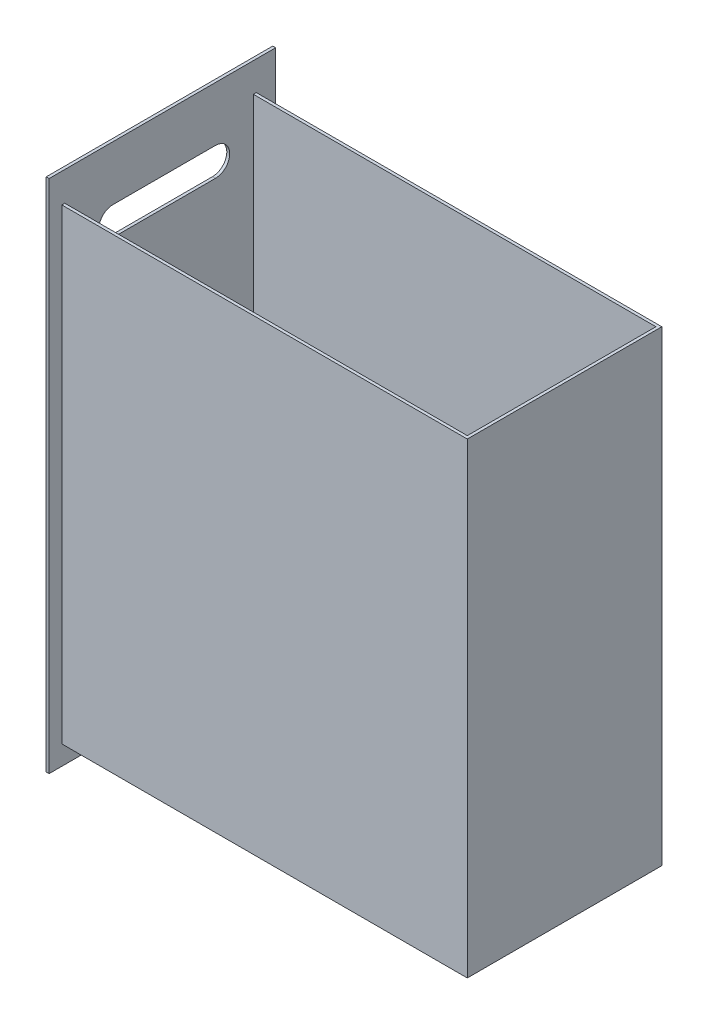
ISO-10303-21;
HEADER;
FILE_DESCRIPTION(('STEP AP214'),'2;1');
FILE_NAME('part.step','',(''),(''),'','','');
FILE_SCHEMA(('AUTOMOTIVE_DESIGN { 1 0 10303 214 1 1 1 1 }'));
ENDSEC;
DATA;
#1=APPLICATION_CONTEXT('core data for automotive mechanical design processes');
#2=APPLICATION_PROTOCOL_DEFINITION('international standard','automotive_design',2000,#1);
#3=PRODUCT_CONTEXT('',#1,'mechanical');
#4=PRODUCT('Part','Part','',(#3));
#5=PRODUCT_RELATED_PRODUCT_CATEGORY('part','',(#4));
#6=PRODUCT_DEFINITION_FORMATION('','',#4);
#7=PRODUCT_DEFINITION_CONTEXT('part definition',#1,'design');
#8=PRODUCT_DEFINITION('design','',#6,#7);
#9=PRODUCT_DEFINITION_SHAPE('','',#8);
#10=(LENGTH_UNIT() NAMED_UNIT(*) SI_UNIT(.MILLI.,.METRE.));
#11=(NAMED_UNIT(*) PLANE_ANGLE_UNIT() SI_UNIT($,.RADIAN.));
#12=(NAMED_UNIT(*) SI_UNIT($,.STERADIAN.) SOLID_ANGLE_UNIT());
#13=UNCERTAINTY_MEASURE_WITH_UNIT(LENGTH_MEASURE(1.E-05),#10,'distance_accuracy_value','');
#14=(GEOMETRIC_REPRESENTATION_CONTEXT(3) GLOBAL_UNCERTAINTY_ASSIGNED_CONTEXT((#13)) GLOBAL_UNIT_ASSIGNED_CONTEXT((#10,
#11,#12)) REPRESENTATION_CONTEXT('',''));
#15=CARTESIAN_POINT('',(0.,0.,0.));
#16=DIRECTION('',(0.,0.,1.));
#17=DIRECTION('',(1.,0.,0.));
#18=AXIS2_PLACEMENT_3D('',#15,#16,#17);
#19=CARTESIAN_POINT('',(-210.,3.,-100.));
#20=DIRECTION('',(0.,0.,1.));
#21=DIRECTION('',(1.,0.,0.));
#22=AXIS2_PLACEMENT_3D('',#19,#20,#21);
#23=PLANE('',#22);
#24=DIRECTION('',(0.,-1.,0.));
#25=VECTOR('',#24,1.);
#26=CARTESIAN_POINT('',(-207.,3.,-100.));
#27=LINE('',#26,#25);
#28=CARTESIAN_POINT('',(-207.,480.,-100.));
#29=VERTEX_POINT('',#28);
#30=CARTESIAN_POINT('',(-207.,0.,-100.));
#31=VERTEX_POINT('',#30);
#32=EDGE_CURVE('E251',#29,#31,#27,.T.);
#33=ORIENTED_EDGE('',*,*,#32,.F.);
#34=DIRECTION('',(-1.,0.,0.));
#35=VECTOR('',#34,1.);
#36=CARTESIAN_POINT('',(-210.,480.,-100.));
#37=LINE('',#36,#35);
#38=CARTESIAN_POINT('',(210.,480.,-100.));
#39=VERTEX_POINT('',#38);
#40=EDGE_CURVE('E284',#39,#29,#37,.T.);
#41=ORIENTED_EDGE('',*,*,#40,.F.);
#42=DIRECTION('',(0.,-1.,0.));
#43=VECTOR('',#42,1.);
#44=CARTESIAN_POINT('',(210.,3.,-100.));
#45=LINE('',#44,#43);
#46=CARTESIAN_POINT('',(210.,0.,-100.));
#47=VERTEX_POINT('',#46);
#48=EDGE_CURVE('E12',#39,#47,#45,.T.);
#49=ORIENTED_EDGE('',*,*,#48,.T.);
#50=DIRECTION('',(-1.,0.,0.));
#51=VECTOR('',#50,1.);
#52=CARTESIAN_POINT('',(-210.,0.,-100.));
#53=LINE('',#52,#51);
#54=EDGE_CURVE('E292',#47,#31,#53,.T.);
#55=ORIENTED_EDGE('',*,*,#54,.T.);
#56=EDGE_LOOP('',(#33,#41,#49,#55));
#57=FACE_BOUND('',#56,.T.);
#58=ADVANCED_FACE('F61',(#57),#23,.F.);
#59=CARTESIAN_POINT('',(-210.,3.,100.));
#60=DIRECTION('',(0.,0.,-1.));
#61=DIRECTION('',(-1.,0.,0.));
#62=AXIS2_PLACEMENT_3D('',#59,#60,#61);
#63=PLANE('',#62);
#64=DIRECTION('',(0.,1.,0.));
#65=VECTOR('',#64,1.);
#66=CARTESIAN_POINT('',(-207.,3.,100.));
#67=LINE('',#66,#65);
#68=CARTESIAN_POINT('',(-207.,0.,100.));
#69=VERTEX_POINT('',#68);
#70=CARTESIAN_POINT('',(-207.,480.,100.));
#71=VERTEX_POINT('',#70);
#72=EDGE_CURVE('E245',#69,#71,#67,.T.);
#73=ORIENTED_EDGE('',*,*,#72,.F.);
#74=DIRECTION('',(1.,0.,0.));
#75=VECTOR('',#74,1.);
#76=CARTESIAN_POINT('',(-210.,0.,100.));
#77=LINE('',#76,#75);
#78=CARTESIAN_POINT('',(210.,0.,100.));
#79=VERTEX_POINT('',#78);
#80=EDGE_CURVE('E295',#69,#79,#77,.T.);
#81=ORIENTED_EDGE('',*,*,#80,.T.);
#82=DIRECTION('',(0.,-1.,0.));
#83=VECTOR('',#82,1.);
#84=CARTESIAN_POINT('',(210.,3.,100.));
#85=LINE('',#84,#83);
#86=CARTESIAN_POINT('',(210.,480.,100.));
#87=VERTEX_POINT('',#86);
#88=EDGE_CURVE('E69',#87,#79,#85,.T.);
#89=ORIENTED_EDGE('',*,*,#88,.F.);
#90=DIRECTION('',(1.,0.,0.));
#91=VECTOR('',#90,1.);
#92=CARTESIAN_POINT('',(-210.,480.,100.));
#93=LINE('',#92,#91);
#94=EDGE_CURVE('E287',#71,#87,#93,.T.);
#95=ORIENTED_EDGE('',*,*,#94,.F.);
#96=EDGE_LOOP('',(#73,#81,#89,#95));
#97=FACE_BOUND('',#96,.T.);
#98=ADVANCED_FACE('F313',(#97),#63,.F.);
#99=CARTESIAN_POINT('',(0.,0.,0.));
#100=DIRECTION('',(0.,-1.,0.));
#101=DIRECTION('',(0.,0.,-1.));
#102=AXIS2_PLACEMENT_3D('',#99,#100,#101);
#103=PLANE('',#102);
#104=ORIENTED_EDGE('',*,*,#80,.F.);
#105=DIRECTION('',(0.,0.,-1.));
#106=VECTOR('',#105,1.);
#107=CARTESIAN_POINT('',(-207.,0.,0.));
#108=LINE('',#107,#106);
#109=EDGE_CURVE('E248',#69,#31,#108,.T.);
#110=ORIENTED_EDGE('',*,*,#109,.T.);
#111=ORIENTED_EDGE('',*,*,#54,.F.);
#112=DIRECTION('',(0.,0.,-1.));
#113=VECTOR('',#112,1.);
#114=CARTESIAN_POINT('',(210.,0.,100.));
#115=LINE('',#114,#113);
#116=EDGE_CURVE('E289',#79,#47,#115,.T.);
#117=ORIENTED_EDGE('',*,*,#116,.F.);
#118=EDGE_LOOP('',(#104,#110,#111,#117));
#119=FACE_BOUND('',#118,.T.);
#120=ADVANCED_FACE('F305',(#119),#103,.T.);
#121=CARTESIAN_POINT('',(0.,480.,0.));
#122=DIRECTION('',(0.,1.,0.));
#123=DIRECTION('',(0.,0.,1.));
#124=AXIS2_PLACEMENT_3D('',#121,#122,#123);
#125=PLANE('',#124);
#126=ORIENTED_EDGE('',*,*,#40,.T.);
#127=DIRECTION('',(0.,0.,1.));
#128=VECTOR('',#127,1.);
#129=CARTESIAN_POINT('',(-207.,480.,0.));
#130=LINE('',#129,#128);
#131=CARTESIAN_POINT('',(-207.,480.,-97.));
#132=VERTEX_POINT('',#131);
#133=EDGE_CURVE('E246',#29,#132,#130,.T.);
#134=ORIENTED_EDGE('',*,*,#133,.T.);
#135=DIRECTION('',(-1.,0.,0.));
#136=VECTOR('',#135,1.);
#137=CARTESIAN_POINT('',(0.,480.,-97.));
#138=LINE('',#137,#136);
#139=CARTESIAN_POINT('',(207.,480.,-97.));
#140=VERTEX_POINT('',#139);
#141=EDGE_CURVE('E255',#140,#132,#138,.T.);
#142=ORIENTED_EDGE('',*,*,#141,.F.);
#143=DIRECTION('',(0.,0.,-1.));
#144=VECTOR('',#143,1.);
#145=CARTESIAN_POINT('',(207.,480.,0.));
#146=LINE('',#145,#144);
#147=CARTESIAN_POINT('',(207.,480.,97.));
#148=VERTEX_POINT('',#147);
#149=EDGE_CURVE('E253',#148,#140,#146,.T.);
#150=ORIENTED_EDGE('',*,*,#149,.F.);
#151=DIRECTION('',(1.,0.,0.));
#152=VECTOR('',#151,1.);
#153=CARTESIAN_POINT('',(0.,480.,97.));
#154=LINE('',#153,#152);
#155=CARTESIAN_POINT('',(-207.,480.,97.));
#156=VERTEX_POINT('',#155);
#157=EDGE_CURVE('E259',#156,#148,#154,.T.);
#158=ORIENTED_EDGE('',*,*,#157,.F.);
#159=EDGE_CURVE('E237',#156,#71,#130,.T.);
#160=ORIENTED_EDGE('',*,*,#159,.T.);
#161=ORIENTED_EDGE('',*,*,#94,.T.);
#162=DIRECTION('',(0.,0.,-1.));
#163=VECTOR('',#162,1.);
#164=CARTESIAN_POINT('',(210.,480.,100.));
#165=LINE('',#164,#163);
#166=EDGE_CURVE('E281',#87,#39,#165,.T.);
#167=ORIENTED_EDGE('',*,*,#166,.T.);
#168=EDGE_LOOP('',(#126,#134,#142,#150,#158,#160,#161,#167));
#169=FACE_BOUND('',#168,.T.);
#170=ADVANCED_FACE('F310',(#169),#125,.T.);
#171=CARTESIAN_POINT('',(210.,3.,100.));
#172=DIRECTION('',(-1.,0.,0.));
#173=DIRECTION('',(0.,0.,1.));
#174=AXIS2_PLACEMENT_3D('',#171,#172,#173);
#175=PLANE('',#174);
#176=ORIENTED_EDGE('',*,*,#116,.T.);
#177=ORIENTED_EDGE('',*,*,#48,.F.);
#178=ORIENTED_EDGE('',*,*,#166,.F.);
#179=ORIENTED_EDGE('',*,*,#88,.T.);
#180=EDGE_LOOP('',(#176,#177,#178,#179));
#181=FACE_BOUND('',#180,.T.);
#182=ADVANCED_FACE('F63',(#181),#175,.F.);
#183=CARTESIAN_POINT('',(207.,480.,0.));
#184=DIRECTION('',(-1.,0.,0.));
#185=DIRECTION('',(0.,0.,1.));
#186=AXIS2_PLACEMENT_3D('',#183,#184,#185);
#187=PLANE('',#186);
#188=DIRECTION('',(0.,0.,-1.));
#189=VECTOR('',#188,1.);
#190=CARTESIAN_POINT('',(207.,3.,0.));
#191=LINE('',#190,#189);
#192=CARTESIAN_POINT('',(207.,3.,97.));
#193=VERTEX_POINT('',#192);
#194=CARTESIAN_POINT('',(207.,3.,-97.));
#195=VERTEX_POINT('',#194);
#196=EDGE_CURVE('E262',#193,#195,#191,.T.);
#197=ORIENTED_EDGE('',*,*,#196,.F.);
#198=DIRECTION('',(0.,-1.,0.));
#199=VECTOR('',#198,1.);
#200=CARTESIAN_POINT('',(207.,480.,97.));
#201=LINE('',#200,#199);
#202=EDGE_CURVE('E261',#148,#193,#201,.T.);
#203=ORIENTED_EDGE('',*,*,#202,.F.);
#204=ORIENTED_EDGE('',*,*,#149,.T.);
#205=DIRECTION('',(0.,-1.,0.));
#206=VECTOR('',#205,1.);
#207=CARTESIAN_POINT('',(207.,480.,-97.));
#208=LINE('',#207,#206);
#209=EDGE_CURVE('E278',#140,#195,#208,.T.);
#210=ORIENTED_EDGE('',*,*,#209,.T.);
#211=EDGE_LOOP('',(#197,#203,#204,#210));
#212=FACE_BOUND('',#211,.T.);
#213=ADVANCED_FACE('F325',(#212),#187,.T.);
#214=CARTESIAN_POINT('',(0.,480.,-97.));
#215=DIRECTION('',(0.,0.,1.));
#216=DIRECTION('',(1.,0.,0.));
#217=AXIS2_PLACEMENT_3D('',#214,#215,#216);
#218=PLANE('',#217);
#219=DIRECTION('',(-1.,0.,0.));
#220=VECTOR('',#219,1.);
#221=CARTESIAN_POINT('',(0.,3.,-97.));
#222=LINE('',#221,#220);
#223=CARTESIAN_POINT('',(-207.,3.,-97.));
#224=VERTEX_POINT('',#223);
#225=EDGE_CURVE('E265',#195,#224,#222,.T.);
#226=ORIENTED_EDGE('',*,*,#225,.F.);
#227=ORIENTED_EDGE('',*,*,#209,.F.);
#228=ORIENTED_EDGE('',*,*,#141,.T.);
#229=DIRECTION('',(0.,-1.,0.));
#230=VECTOR('',#229,1.);
#231=CARTESIAN_POINT('',(-207.,480.,-97.));
#232=LINE('',#231,#230);
#233=EDGE_CURVE('E276',#132,#224,#232,.T.);
#234=ORIENTED_EDGE('',*,*,#233,.T.);
#235=EDGE_LOOP('',(#226,#227,#228,#234));
#236=FACE_BOUND('',#235,.T.);
#237=ADVANCED_FACE('F322',(#236),#218,.T.);
#238=CARTESIAN_POINT('',(-207.,480.,0.));
#239=DIRECTION('',(1.,0.,0.));
#240=DIRECTION('',(0.,0.,-1.));
#241=AXIS2_PLACEMENT_3D('',#238,#239,#240);
#242=PLANE('',#241);
#243=CARTESIAN_POINT('',(-207.,439.289461348973,-58.0545610086643));
#244=DIRECTION('',(-1.,0.,0.));
#245=DIRECTION('',(0.,0.,1.));
#246=AXIS2_PLACEMENT_3D('',#243,#244,#245);
#247=CIRCLE('',#246,14.6357409679074);
#248=CARTESIAN_POINT('',(-207.,453.92520231688,-58.0545610086643));
#249=VERTEX_POINT('',#248);
#250=CARTESIAN_POINT('',(-207.,424.653720381065,-58.0545610086643));
#251=VERTEX_POINT('',#250);
#252=EDGE_CURVE('E176',#249,#251,#247,.T.);
#253=ORIENTED_EDGE('',*,*,#252,.T.);
#254=DIRECTION('',(0.,0.,1.));
#255=VECTOR('',#254,1.);
#256=CARTESIAN_POINT('',(-207.,424.653720381065,-58.0545610086643));
#257=LINE('',#256,#255);
#258=CARTESIAN_POINT('',(-207.,424.653720381065,47.3227739602692));
#259=VERTEX_POINT('',#258);
#260=EDGE_CURVE('E185',#251,#259,#257,.T.);
#261=ORIENTED_EDGE('',*,*,#260,.T.);
#262=CARTESIAN_POINT('',(-207.,439.289461348973,47.3227739602692));
#263=DIRECTION('',(-1.,0.,0.));
#264=DIRECTION('',(0.,0.,1.));
#265=AXIS2_PLACEMENT_3D('',#262,#263,#264);
#266=CIRCLE('',#265,14.6357409679074);
#267=CARTESIAN_POINT('',(-207.,453.92520231688,47.3227739602692));
#268=VERTEX_POINT('',#267);
#269=EDGE_CURVE('E76',#259,#268,#266,.T.);
#270=ORIENTED_EDGE('',*,*,#269,.T.);
#271=DIRECTION('',(0.,0.,-1.));
#272=VECTOR('',#271,1.);
#273=CARTESIAN_POINT('',(-207.,453.92520231688,-58.0545610086643));
#274=LINE('',#273,#272);
#275=EDGE_CURVE('E182',#268,#249,#274,.T.);
#276=ORIENTED_EDGE('',*,*,#275,.T.);
#277=EDGE_LOOP('',(#253,#261,#270,#276));
#278=FACE_BOUND('',#277,.T.);
#279=DIRECTION('',(0.,0.,1.));
#280=VECTOR('',#279,1.);
#281=CARTESIAN_POINT('',(-207.,3.,0.));
#282=LINE('',#281,#280);
#283=CARTESIAN_POINT('',(-207.,3.,97.));
#284=VERTEX_POINT('',#283);
#285=EDGE_CURVE('E268',#224,#284,#282,.T.);
#286=ORIENTED_EDGE('',*,*,#285,.F.);
#287=ORIENTED_EDGE('',*,*,#233,.F.);
#288=ORIENTED_EDGE('',*,*,#133,.F.);
#289=ORIENTED_EDGE('',*,*,#32,.T.);
#290=ORIENTED_EDGE('',*,*,#109,.F.);
#291=ORIENTED_EDGE('',*,*,#72,.T.);
#292=ORIENTED_EDGE('',*,*,#159,.F.);
#293=DIRECTION('',(0.,-1.,0.));
#294=VECTOR('',#293,1.);
#295=CARTESIAN_POINT('',(-207.,480.,97.));
#296=LINE('',#295,#294);
#297=EDGE_CURVE('E274',#156,#284,#296,.T.);
#298=ORIENTED_EDGE('',*,*,#297,.T.);
#299=EDGE_LOOP('',(#286,#287,#288,#289,#290,#291,#292,#298));
#300=FACE_BOUND('',#299,.T.);
#301=DIRECTION('',(0.,-1.,0.));
#302=VECTOR('',#301,1.);
#303=CARTESIAN_POINT('',(-207.,510.,-120.));
#304=LINE('',#303,#302);
#305=CARTESIAN_POINT('',(-207.,510.,-120.));
#306=VERTEX_POINT('',#305);
#307=CARTESIAN_POINT('',(-207.,-20.,-120.));
#308=VERTEX_POINT('',#307);
#309=EDGE_CURVE('E211',#306,#308,#304,.T.);
#310=ORIENTED_EDGE('',*,*,#309,.F.);
#311=DIRECTION('',(0.,0.,-1.));
#312=VECTOR('',#311,1.);
#313=CARTESIAN_POINT('',(-207.,510.,-120.));
#314=LINE('',#313,#312);
#315=CARTESIAN_POINT('',(-207.,510.,113.));
#316=VERTEX_POINT('',#315);
#317=EDGE_CURVE('E221',#316,#306,#314,.T.);
#318=ORIENTED_EDGE('',*,*,#317,.F.);
#319=DIRECTION('',(0.,1.,0.));
#320=VECTOR('',#319,1.);
#321=CARTESIAN_POINT('',(-207.,510.,113.));
#322=LINE('',#321,#320);
#323=CARTESIAN_POINT('',(-207.,-20.,113.));
#324=VERTEX_POINT('',#323);
#325=EDGE_CURVE('E218',#324,#316,#322,.T.);
#326=ORIENTED_EDGE('',*,*,#325,.F.);
#327=DIRECTION('',(0.,0.,1.));
#328=VECTOR('',#327,1.);
#329=CARTESIAN_POINT('',(-207.,-20.,-120.));
#330=LINE('',#329,#328);
#331=EDGE_CURVE('E214',#308,#324,#330,.T.);
#332=ORIENTED_EDGE('',*,*,#331,.F.);
#333=EDGE_LOOP('',(#310,#318,#326,#332));
#334=FACE_BOUND('',#333,.T.);
#335=ADVANCED_FACE('F189',(#278,#300,#334),#242,.T.);
#336=CARTESIAN_POINT('',(0.,480.,97.));
#337=DIRECTION('',(0.,0.,-1.));
#338=DIRECTION('',(-1.,0.,0.));
#339=AXIS2_PLACEMENT_3D('',#336,#337,#338);
#340=PLANE('',#339);
#341=DIRECTION('',(1.,0.,0.));
#342=VECTOR('',#341,1.);
#343=CARTESIAN_POINT('',(0.,3.,97.));
#344=LINE('',#343,#342);
#345=EDGE_CURVE('E256',#284,#193,#344,.T.);
#346=ORIENTED_EDGE('',*,*,#345,.F.);
#347=ORIENTED_EDGE('',*,*,#297,.F.);
#348=ORIENTED_EDGE('',*,*,#157,.T.);
#349=ORIENTED_EDGE('',*,*,#202,.T.);
#350=EDGE_LOOP('',(#346,#347,#348,#349));
#351=FACE_BOUND('',#350,.T.);
#352=ADVANCED_FACE('F331',(#351),#340,.T.);
#353=CARTESIAN_POINT('',(0.,3.,0.));
#354=DIRECTION('',(0.,-1.,0.));
#355=DIRECTION('',(0.,0.,-1.));
#356=AXIS2_PLACEMENT_3D('',#353,#354,#355);
#357=PLANE('',#356);
#358=ORIENTED_EDGE('',*,*,#345,.T.);
#359=ORIENTED_EDGE('',*,*,#196,.T.);
#360=ORIENTED_EDGE('',*,*,#225,.T.);
#361=ORIENTED_EDGE('',*,*,#285,.T.);
#362=EDGE_LOOP('',(#358,#359,#360,#361));
#363=FACE_BOUND('',#362,.T.);
#364=ADVANCED_FACE('F328',(#363),#357,.F.);
#365=CARTESIAN_POINT('',(-207.,510.,-120.));
#366=DIRECTION('',(0.,0.,-1.));
#367=DIRECTION('',(0.,1.,0.));
#368=AXIS2_PLACEMENT_3D('',#365,#366,#367);
#369=PLANE('',#368);
#370=DIRECTION('',(0.,-1.,0.));
#371=VECTOR('',#370,1.);
#372=CARTESIAN_POINT('',(-210.,510.,-120.));
#373=LINE('',#372,#371);
#374=CARTESIAN_POINT('',(-210.,510.,-120.));
#375=VERTEX_POINT('',#374);
#376=CARTESIAN_POINT('',(-210.,-20.,-120.));
#377=VERTEX_POINT('',#376);
#378=EDGE_CURVE('E207',#375,#377,#373,.T.);
#379=ORIENTED_EDGE('',*,*,#378,.F.);
#380=DIRECTION('',(-1.,0.,0.));
#381=VECTOR('',#380,1.);
#382=CARTESIAN_POINT('',(-207.,510.,-120.));
#383=LINE('',#382,#381);
#384=EDGE_CURVE('E235',#306,#375,#383,.T.);
#385=ORIENTED_EDGE('',*,*,#384,.F.);
#386=ORIENTED_EDGE('',*,*,#309,.T.);
#387=DIRECTION('',(-1.,0.,0.));
#388=VECTOR('',#387,1.);
#389=CARTESIAN_POINT('',(-207.,-20.,-120.));
#390=LINE('',#389,#388);
#391=EDGE_CURVE('E224',#308,#377,#390,.T.);
#392=ORIENTED_EDGE('',*,*,#391,.T.);
#393=EDGE_LOOP('',(#379,#385,#386,#392));
#394=FACE_BOUND('',#393,.T.);
#395=ADVANCED_FACE('F339',(#394),#369,.T.);
#396=CARTESIAN_POINT('',(-207.,510.,-120.));
#397=DIRECTION('',(0.,1.,0.));
#398=DIRECTION('',(0.,0.,1.));
#399=AXIS2_PLACEMENT_3D('',#396,#397,#398);
#400=PLANE('',#399);
#401=DIRECTION('',(0.,0.,-1.));
#402=VECTOR('',#401,1.);
#403=CARTESIAN_POINT('',(-210.,510.,-120.));
#404=LINE('',#403,#402);
#405=CARTESIAN_POINT('',(-210.,510.,113.));
#406=VERTEX_POINT('',#405);
#407=EDGE_CURVE('E215',#406,#375,#404,.T.);
#408=ORIENTED_EDGE('',*,*,#407,.F.);
#409=DIRECTION('',(-1.,0.,0.));
#410=VECTOR('',#409,1.);
#411=CARTESIAN_POINT('',(-207.,510.,113.));
#412=LINE('',#411,#410);
#413=EDGE_CURVE('E238',#316,#406,#412,.T.);
#414=ORIENTED_EDGE('',*,*,#413,.F.);
#415=ORIENTED_EDGE('',*,*,#317,.T.);
#416=ORIENTED_EDGE('',*,*,#384,.T.);
#417=EDGE_LOOP('',(#408,#414,#415,#416));
#418=FACE_BOUND('',#417,.T.);
#419=ADVANCED_FACE('F407',(#418),#400,.T.);
#420=CARTESIAN_POINT('',(-207.,510.,113.));
#421=DIRECTION('',(0.,0.,1.));
#422=DIRECTION('',(0.,-1.,0.));
#423=AXIS2_PLACEMENT_3D('',#420,#421,#422);
#424=PLANE('',#423);
#425=DIRECTION('',(0.,1.,0.));
#426=VECTOR('',#425,1.);
#427=CARTESIAN_POINT('',(-210.,510.,113.));
#428=LINE('',#427,#426);
#429=CARTESIAN_POINT('',(-210.,-20.,113.));
#430=VERTEX_POINT('',#429);
#431=EDGE_CURVE('E230',#430,#406,#428,.T.);
#432=ORIENTED_EDGE('',*,*,#431,.F.);
#433=DIRECTION('',(-1.,0.,0.));
#434=VECTOR('',#433,1.);
#435=CARTESIAN_POINT('',(-207.,-20.,113.));
#436=LINE('',#435,#434);
#437=EDGE_CURVE('E240',#324,#430,#436,.T.);
#438=ORIENTED_EDGE('',*,*,#437,.F.);
#439=ORIENTED_EDGE('',*,*,#325,.T.);
#440=ORIENTED_EDGE('',*,*,#413,.T.);
#441=EDGE_LOOP('',(#432,#438,#439,#440));
#442=FACE_BOUND('',#441,.T.);
#443=ADVANCED_FACE('F415',(#442),#424,.T.);
#444=CARTESIAN_POINT('',(-207.,-20.,-120.));
#445=DIRECTION('',(0.,-1.,0.));
#446=DIRECTION('',(0.,0.,-1.));
#447=AXIS2_PLACEMENT_3D('',#444,#445,#446);
#448=PLANE('',#447);
#449=DIRECTION('',(0.,0.,1.));
#450=VECTOR('',#449,1.);
#451=CARTESIAN_POINT('',(-210.,-20.,-120.));
#452=LINE('',#451,#450);
#453=EDGE_CURVE('E227',#377,#430,#452,.T.);
#454=ORIENTED_EDGE('',*,*,#453,.F.);
#455=ORIENTED_EDGE('',*,*,#391,.F.);
#456=ORIENTED_EDGE('',*,*,#331,.T.);
#457=ORIENTED_EDGE('',*,*,#437,.T.);
#458=EDGE_LOOP('',(#454,#455,#456,#457));
#459=FACE_BOUND('',#458,.T.);
#460=ADVANCED_FACE('F353',(#459),#448,.T.);
#461=CARTESIAN_POINT('',(-210.,3.,100.));
#462=DIRECTION('',(1.,0.,0.));
#463=DIRECTION('',(0.,0.,-1.));
#464=AXIS2_PLACEMENT_3D('',#461,#462,#463);
#465=PLANE('',#464);
#466=DIRECTION('',(0.,0.,1.));
#467=VECTOR('',#466,1.);
#468=CARTESIAN_POINT('',(-210.,424.653720381065,-58.0545610086643));
#469=LINE('',#468,#467);
#470=CARTESIAN_POINT('',(-210.,424.653720381065,-58.0545610086644));
#471=VERTEX_POINT('',#470);
#472=CARTESIAN_POINT('',(-210.,424.653720381065,47.3227739602692));
#473=VERTEX_POINT('',#472);
#474=EDGE_CURVE('E201',#471,#473,#469,.T.);
#475=ORIENTED_EDGE('',*,*,#474,.F.);
#476=CARTESIAN_POINT('',(-210.,439.289461348973,-58.0545610086643));
#477=DIRECTION('',(-1.,0.,0.));
#478=DIRECTION('',(0.,0.,1.));
#479=AXIS2_PLACEMENT_3D('',#476,#477,#478);
#480=CIRCLE('',#479,14.6357409679074);
#481=CARTESIAN_POINT('',(-210.,453.92520231688,-58.0545610086643));
#482=VERTEX_POINT('',#481);
#483=EDGE_CURVE('E84',#482,#471,#480,.T.);
#484=ORIENTED_EDGE('',*,*,#483,.F.);
#485=DIRECTION('',(0.,0.,-1.));
#486=VECTOR('',#485,1.);
#487=CARTESIAN_POINT('',(-210.,453.92520231688,-58.0545610086643));
#488=LINE('',#487,#486);
#489=CARTESIAN_POINT('',(-210.,453.92520231688,47.3227739602692));
#490=VERTEX_POINT('',#489);
#491=EDGE_CURVE('E192',#490,#482,#488,.T.);
#492=ORIENTED_EDGE('',*,*,#491,.F.);
#493=CARTESIAN_POINT('',(-210.,439.289461348973,47.3227739602692));
#494=DIRECTION('',(-1.,0.,0.));
#495=DIRECTION('',(0.,0.,1.));
#496=AXIS2_PLACEMENT_3D('',#493,#494,#495);
#497=CIRCLE('',#496,14.6357409679074);
#498=EDGE_CURVE('E195',#473,#490,#497,.T.);
#499=ORIENTED_EDGE('',*,*,#498,.F.);
#500=EDGE_LOOP('',(#475,#484,#492,#499));
#501=FACE_BOUND('',#500,.T.);
#502=ORIENTED_EDGE('',*,*,#378,.T.);
#503=ORIENTED_EDGE('',*,*,#453,.T.);
#504=ORIENTED_EDGE('',*,*,#431,.T.);
#505=ORIENTED_EDGE('',*,*,#407,.T.);
#506=EDGE_LOOP('',(#502,#503,#504,#505));
#507=FACE_BOUND('',#506,.T.);
#508=ADVANCED_FACE('F351',(#501,#507),#465,.F.);
#509=CARTESIAN_POINT('',(-207.,439.289461348973,-58.0545610086643));
#510=DIRECTION('',(-1.,0.,0.));
#511=DIRECTION('',(0.,0.,1.));
#512=AXIS2_PLACEMENT_3D('',#509,#510,#511);
#513=CYLINDRICAL_SURFACE('',#512,14.6357409679074);
#514=ORIENTED_EDGE('',*,*,#483,.T.);
#515=DIRECTION('',(-1.,0.,0.));
#516=VECTOR('',#515,1.);
#517=CARTESIAN_POINT('',(-207.,424.653720381065,-58.0545610086643));
#518=LINE('',#517,#516);
#519=EDGE_CURVE('E172',#251,#471,#518,.T.);
#520=ORIENTED_EDGE('',*,*,#519,.F.);
#521=ORIENTED_EDGE('',*,*,#252,.F.);
#522=DIRECTION('',(-1.,0.,0.));
#523=VECTOR('',#522,1.);
#524=CARTESIAN_POINT('',(-207.,453.92520231688,-58.0545610086643));
#525=LINE('',#524,#523);
#526=EDGE_CURVE('E205',#249,#482,#525,.T.);
#527=ORIENTED_EDGE('',*,*,#526,.T.);
#528=EDGE_LOOP('',(#514,#520,#521,#527));
#529=FACE_BOUND('',#528,.T.);
#530=ADVANCED_FACE('F174',(#529),#513,.F.);
#531=CARTESIAN_POINT('',(-207.,453.92520231688,-58.0545610086643));
#532=DIRECTION('',(0.,1.,0.));
#533=DIRECTION('',(0.,0.,1.));
#534=AXIS2_PLACEMENT_3D('',#531,#532,#533);
#535=PLANE('',#534);
#536=ORIENTED_EDGE('',*,*,#491,.T.);
#537=ORIENTED_EDGE('',*,*,#526,.F.);
#538=ORIENTED_EDGE('',*,*,#275,.F.);
#539=DIRECTION('',(-1.,0.,0.));
#540=VECTOR('',#539,1.);
#541=CARTESIAN_POINT('',(-207.,453.92520231688,47.3227739602692));
#542=LINE('',#541,#540);
#543=EDGE_CURVE('E208',#268,#490,#542,.T.);
#544=ORIENTED_EDGE('',*,*,#543,.T.);
#545=EDGE_LOOP('',(#536,#537,#538,#544));
#546=FACE_BOUND('',#545,.T.);
#547=ADVANCED_FACE('F449',(#546),#535,.F.);
#548=CARTESIAN_POINT('',(-207.,439.289461348973,47.3227739602692));
#549=DIRECTION('',(-1.,0.,0.));
#550=DIRECTION('',(0.,0.,1.));
#551=AXIS2_PLACEMENT_3D('',#548,#549,#550);
#552=CYLINDRICAL_SURFACE('',#551,14.6357409679074);
#553=ORIENTED_EDGE('',*,*,#498,.T.);
#554=ORIENTED_EDGE('',*,*,#543,.F.);
#555=ORIENTED_EDGE('',*,*,#269,.F.);
#556=DIRECTION('',(-1.,0.,0.));
#557=VECTOR('',#556,1.);
#558=CARTESIAN_POINT('',(-207.,424.653720381065,47.3227739602692));
#559=LINE('',#558,#557);
#560=EDGE_CURVE('E181',#259,#473,#559,.T.);
#561=ORIENTED_EDGE('',*,*,#560,.T.);
#562=EDGE_LOOP('',(#553,#554,#555,#561));
#563=FACE_BOUND('',#562,.T.);
#564=ADVANCED_FACE('F457',(#563),#552,.F.);
#565=CARTESIAN_POINT('',(-207.,424.653720381065,-58.0545610086643));
#566=DIRECTION('',(0.,-1.,0.));
#567=DIRECTION('',(0.,0.,-1.));
#568=AXIS2_PLACEMENT_3D('',#565,#566,#567);
#569=PLANE('',#568);
#570=ORIENTED_EDGE('',*,*,#474,.T.);
#571=ORIENTED_EDGE('',*,*,#560,.F.);
#572=ORIENTED_EDGE('',*,*,#260,.F.);
#573=ORIENTED_EDGE('',*,*,#519,.T.);
#574=EDGE_LOOP('',(#570,#571,#572,#573));
#575=FACE_BOUND('',#574,.T.);
#576=ADVANCED_FACE('F186',(#575),#569,.F.);
#577=CLOSED_SHELL('',(#58,#98,#120,#170,#182,#213,#237,#335,#352,#364,#395,#419,#443,#460,#508,
#530,#547,#564,#576));
#578=MANIFOLD_SOLID_BREP('B2',#577);
#579=ADVANCED_BREP_SHAPE_REPRESENTATION('',(#18,#578),#14);
#580=SHAPE_DEFINITION_REPRESENTATION(#9,#579);
ENDSEC;
END-ISO-10303-21;
